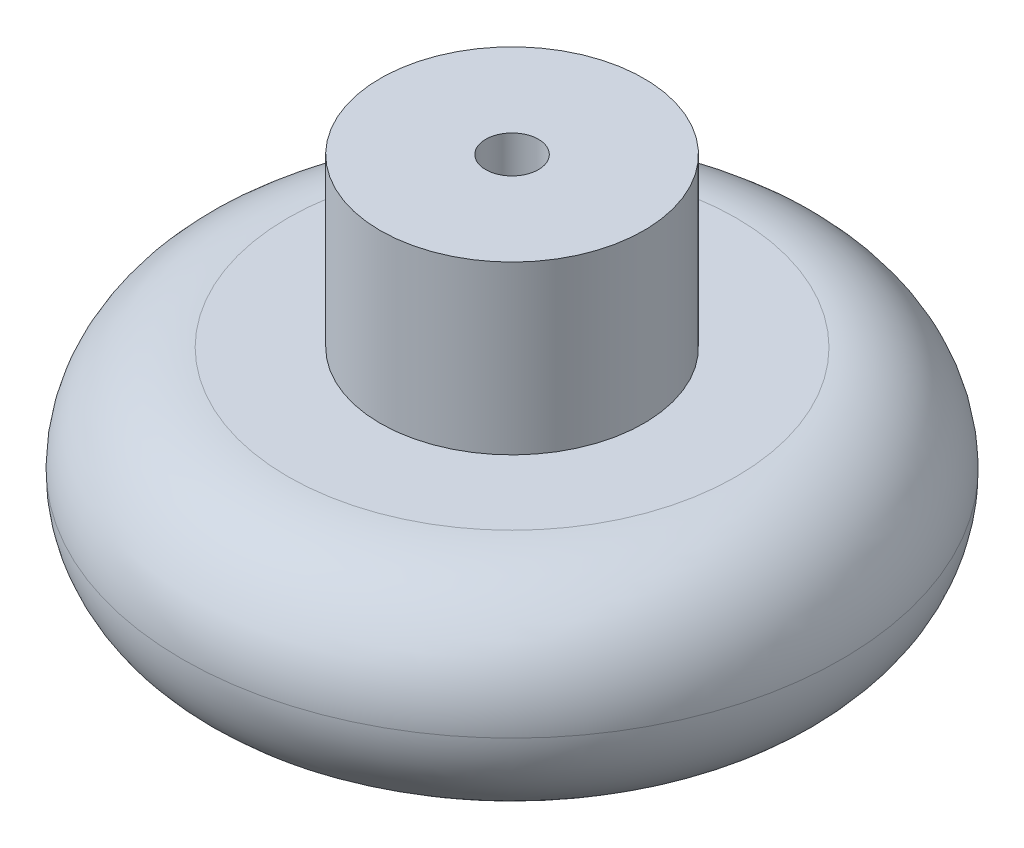
ISO-10303-21;
HEADER;
FILE_DESCRIPTION(('STEP AP214'),'2;1');
FILE_NAME('part.step','',(''),(''),'','','');
FILE_SCHEMA(('AUTOMOTIVE_DESIGN { 1 0 10303 214 1 1 1 1 }'));
ENDSEC;
DATA;
#1=APPLICATION_CONTEXT('core data for automotive mechanical design processes');
#2=APPLICATION_PROTOCOL_DEFINITION('international standard','automotive_design',2000,#1);
#3=PRODUCT_CONTEXT('',#1,'mechanical');
#4=PRODUCT('Part','Part','',(#3));
#5=PRODUCT_RELATED_PRODUCT_CATEGORY('part','',(#4));
#6=PRODUCT_DEFINITION_FORMATION('','',#4);
#7=PRODUCT_DEFINITION_CONTEXT('part definition',#1,'design');
#8=PRODUCT_DEFINITION('design','',#6,#7);
#9=PRODUCT_DEFINITION_SHAPE('','',#8);
#10=(LENGTH_UNIT() NAMED_UNIT(*) SI_UNIT(.MILLI.,.METRE.));
#11=(NAMED_UNIT(*) PLANE_ANGLE_UNIT() SI_UNIT($,.RADIAN.));
#12=(NAMED_UNIT(*) SI_UNIT($,.STERADIAN.) SOLID_ANGLE_UNIT());
#13=UNCERTAINTY_MEASURE_WITH_UNIT(LENGTH_MEASURE(1.E-05),#10,'distance_accuracy_value','');
#14=(GEOMETRIC_REPRESENTATION_CONTEXT(3) GLOBAL_UNCERTAINTY_ASSIGNED_CONTEXT((#13)) GLOBAL_UNIT_ASSIGNED_CONTEXT((#10,
#11,#12)) REPRESENTATION_CONTEXT('',''));
#15=CARTESIAN_POINT('',(0.,0.,0.));
#16=DIRECTION('',(0.,0.,1.));
#17=DIRECTION('',(1.,0.,0.));
#18=AXIS2_PLACEMENT_3D('',#15,#16,#17);
#19=CARTESIAN_POINT('',(0.,24.,0.));
#20=DIRECTION('',(0.,1.,0.));
#21=DIRECTION('',(0.,0.,1.));
#22=AXIS2_PLACEMENT_3D('',#19,#20,#21);
#23=PLANE('',#22);
#24=CARTESIAN_POINT('',(0.,24.,0.));
#25=DIRECTION('',(0.,1.,0.));
#26=DIRECTION('',(0.,0.,1.));
#27=AXIS2_PLACEMENT_3D('',#24,#25,#26);
#28=CIRCLE('',#27,25.5);
#29=CARTESIAN_POINT('',(0.,24.,25.5));
#30=VERTEX_POINT('',#29);
#31=EDGE_CURVE('E46',#30,#30,#28,.T.);
#32=ORIENTED_EDGE('',*,*,#31,.T.);
#33=EDGE_LOOP('',(#32));
#34=FACE_BOUND('',#33,.T.);
#35=CARTESIAN_POINT('',(0.,24.,0.));
#36=DIRECTION('',(0.,1.,0.));
#37=DIRECTION('',(0.,0.,1.));
#38=AXIS2_PLACEMENT_3D('',#35,#36,#37);
#39=CIRCLE('',#38,15.);
#40=CARTESIAN_POINT('',(0.,24.,15.));
#41=VERTEX_POINT('',#40);
#42=EDGE_CURVE('E59',#41,#41,#39,.T.);
#43=ORIENTED_EDGE('',*,*,#42,.F.);
#44=EDGE_LOOP('',(#43));
#45=FACE_BOUND('',#44,.T.);
#46=ADVANCED_FACE('F35',(#34,#45),#23,.T.);
#47=CARTESIAN_POINT('',(0.,0.,0.));
#48=DIRECTION('',(0.,1.,0.));
#49=DIRECTION('',(0.,0.,1.));
#50=AXIS2_PLACEMENT_3D('',#47,#48,#49);
#51=PLANE('',#50);
#52=CARTESIAN_POINT('',(0.,0.,0.));
#53=DIRECTION('',(0.,1.,0.));
#54=DIRECTION('',(0.,0.,1.));
#55=AXIS2_PLACEMENT_3D('',#52,#53,#54);
#56=CIRCLE('',#55,25.5);
#57=CARTESIAN_POINT('',(0.,0.,25.5));
#58=VERTEX_POINT('',#57);
#59=EDGE_CURVE('E71',#58,#58,#56,.F.);
#60=ORIENTED_EDGE('',*,*,#59,.T.);
#61=EDGE_LOOP('',(#60));
#62=FACE_BOUND('',#61,.T.);
#63=ADVANCED_FACE('F100',(#62),#51,.F.);
#64=CARTESIAN_POINT('',(0.,43.,0.));
#65=DIRECTION('',(0.,-1.,0.));
#66=DIRECTION('',(0.,0.,-1.));
#67=AXIS2_PLACEMENT_3D('',#64,#65,#66);
#68=CYLINDRICAL_SURFACE('',#67,15.);
#69=CARTESIAN_POINT('',(-6.9272823588192,32.9898204132693,-13.3046142041471));
#70=CARTESIAN_POINT('',(-6.92727780242257,32.8504446651075,-13.3046183207948));
#71=CARTESIAN_POINT('',(-6.91676671643166,32.7109928071978,-13.31010567698));
#72=CARTESIAN_POINT('',(-6.87496727790503,32.4360018700061,-13.3317424831991));
#73=CARTESIAN_POINT('',(-6.84365976442641,32.3004665195112,-13.3479017658122));
#74=CARTESIAN_POINT('',(-6.76109015046208,32.0373281299277,-13.3899137727955));
#75=CARTESIAN_POINT('',(-6.70984472674675,31.909718564607,-13.4157583953433));
#76=CARTESIAN_POINT('',(-6.58866756767793,31.6658394585515,-13.4756820785763));
#77=CARTESIAN_POINT('',(-6.51873793516153,31.5495686436919,-13.5097602125696));
#78=CARTESIAN_POINT('',(-6.36116067787329,31.3305075635247,-13.5846711696785));
#79=CARTESIAN_POINT('',(-6.27336217770345,31.2278452818831,-13.6255609340721));
#80=CARTESIAN_POINT('',(-6.08254075465278,31.0400271064075,-13.7118065824849));
#81=CARTESIAN_POINT('',(-5.97951693006227,30.9548722501539,-13.7571627309695));
#82=CARTESIAN_POINT('',(-5.76010817704032,30.80400584605,-13.8504666961285));
#83=CARTESIAN_POINT('',(-5.64364715717644,30.7384134055375,-13.8984283681062));
#84=CARTESIAN_POINT('',(-5.40088287131594,30.6292993427387,-13.9945520473443));
#85=CARTESIAN_POINT('',(-5.2745802458889,30.5857762853844,-14.0427140413733));
#86=CARTESIAN_POINT('',(-5.01677816303173,30.5224278782854,-14.1368520282793));
#87=CARTESIAN_POINT('',(-4.88533743550289,30.5023874972646,-14.1828440954133));
#88=CARTESIAN_POINT('',(-4.61988936197311,30.4859046591167,-14.2715169680437));
#89=CARTESIAN_POINT('',(-4.48588219104443,30.489460598022,-14.3141979984093));
#90=CARTESIAN_POINT('',(-4.22052781851019,30.5199017647975,-14.3946582388084));
#91=CARTESIAN_POINT('',(-4.08916741722354,30.5465555766784,-14.4324818123333));
#92=CARTESIAN_POINT('',(-3.83155631870856,30.6220714875158,-14.5030004802094));
#93=CARTESIAN_POINT('',(-3.70530577723147,30.6709342628588,-14.5356954183244));
#94=CARTESIAN_POINT('',(-3.46102259637872,30.7897110535846,-14.5957950709894));
#95=CARTESIAN_POINT('',(-3.34303022811231,30.8597204253517,-14.6231748795355));
#96=CARTESIAN_POINT('',(-3.11934990516638,31.0187332359043,-14.6725183708782));
#97=CARTESIAN_POINT('',(-3.01366294741874,31.1077382119801,-14.6944816150088));
#98=CARTESIAN_POINT('',(-2.81653696715514,31.3034992198886,-14.7335453477559));
#99=CARTESIAN_POINT('',(-2.72528635711333,31.4104575081702,-14.7505836084501));
#100=CARTESIAN_POINT('',(-2.56145212247787,31.6384075034851,-14.779915816086));
#101=CARTESIAN_POINT('',(-2.48886867007452,31.7593993399521,-14.7922097192652));
#102=CARTESIAN_POINT('',(-2.36466896217775,32.0122120551467,-14.8125732135999));
#103=CARTESIAN_POINT('',(-2.31307628245807,32.1440449113614,-14.8206380578099));
#104=CARTESIAN_POINT('',(-2.23275792027019,32.4146694855768,-14.8329517997395));
#105=CARTESIAN_POINT('',(-2.20403022435002,32.5534605897017,-14.8372010334594));
#106=CARTESIAN_POINT('',(-2.17066599096032,32.8322865694314,-14.8421189211581));
#107=CARTESIAN_POINT('',(-2.16574582421522,32.9722867929714,-14.8428297328247));
#108=CARTESIAN_POINT('',(-2.17940233706688,33.2511070849601,-14.8408305453082));
#109=CARTESIAN_POINT('',(-2.19797810910972,33.3899271987832,-14.8381206782522));
#110=CARTESIAN_POINT('',(-2.25777510827337,33.6615481724601,-14.8291384379638));
#111=CARTESIAN_POINT('',(-2.29885234559983,33.7943815531473,-14.8228887082182));
#112=CARTESIAN_POINT('',(-2.40216339111397,34.0512905795487,-14.8064962173186));
#113=CARTESIAN_POINT('',(-2.46439846493326,34.1753657008202,-14.7963532232705));
#114=CARTESIAN_POINT('',(-2.60868149990205,34.4124950076754,-14.7716000327984));
#115=CARTESIAN_POINT('',(-2.69090691097216,34.5254369860253,-14.7569494959644));
#116=CARTESIAN_POINT('',(-2.87229114683576,34.7359339459643,-14.7227185377231));
#117=CARTESIAN_POINT('',(-2.97145116264185,34.833487844379,-14.703137769526));
#118=CARTESIAN_POINT('',(-3.18482055371841,35.011472305998,-14.6584071378269));
#119=CARTESIAN_POINT('',(-3.2991757141507,35.0917142395538,-14.6332014747938));
#120=CARTESIAN_POINT('',(-3.53866048386326,35.2314757402741,-14.5771390938573));
#121=CARTESIAN_POINT('',(-3.66378974446007,35.2909959777431,-14.5462825587974));
#122=CARTESIAN_POINT('',(-3.92049009047511,35.3873309972241,-14.4792010695717));
#123=CARTESIAN_POINT('',(-4.05203042361762,35.4242444890042,-14.4430003231728));
#124=CARTESIAN_POINT('',(-4.31811984807649,35.4746360122331,-14.3656890679258));
#125=CARTESIAN_POINT('',(-4.45266869090293,35.4881159720016,-14.3245789633609));
#126=CARTESIAN_POINT('',(-4.71916345604954,35.4912022955814,-14.2389904540563));
#127=CARTESIAN_POINT('',(-4.85112117133239,35.4810956672103,-14.1945588452304));
#128=CARTESIAN_POINT('',(-5.11036349414499,35.4379164909998,-14.1033001419827));
#129=CARTESIAN_POINT('',(-5.2376481278379,35.4048440717596,-14.0564730609759));
#130=CARTESIAN_POINT('',(-5.4839660244091,35.3167822477256,-13.9622169504601));
#131=CARTESIAN_POINT('',(-5.60300830162987,35.2618172450592,-13.9147886478859));
#132=CARTESIAN_POINT('',(-5.82996234609605,35.1315624770387,-13.8212381435791));
#133=CARTESIAN_POINT('',(-5.93787358537406,35.0562717482068,-13.7751160038757));
#134=CARTESIAN_POINT('',(-6.14110194818678,34.8864853208088,-13.6857352592499));
#135=CARTESIAN_POINT('',(-6.23626060304549,34.791779458518,-13.6425155193918));
#136=CARTESIAN_POINT('',(-6.41023305640028,34.5862921053654,-13.5616422167671));
#137=CARTESIAN_POINT('',(-6.48904302127271,34.4755068543567,-13.5239899601193));
#138=CARTESIAN_POINT('',(-6.62889146567425,34.2400750907796,-13.4559988345835));
#139=CARTESIAN_POINT('',(-6.68980029516544,34.1153360735038,-13.4257135809461));
#140=CARTESIAN_POINT('',(-6.79152387102892,33.8562111774311,-13.3745457212693));
#141=CARTESIAN_POINT('',(-6.83235869165766,33.7218350905919,-13.3536537236512));
#142=CARTESIAN_POINT('',(-6.88410831618734,33.4874166437819,-13.3270256248412));
#143=CARTESIAN_POINT('',(-6.90027627654882,33.3887936053067,-13.3186461880029));
#144=CARTESIAN_POINT('',(-6.92186483722055,33.1900669284323,-13.3074390491218));
#145=CARTESIAN_POINT('',(-6.92728563263689,33.0899633169451,-13.3046112462935));
#146=CARTESIAN_POINT('',(-6.9272823588192,32.9898204132693,-13.3046142041471));
#147=B_SPLINE_CURVE_WITH_KNOTS('',3,(#69,#70,#71,#72,#73,#74,#75,#76,#77,#78,#79,#80,#81,#82,
#83,#84,#85,#86,#87,#88,#89,#90,#91,#92,#93,#94,#95,#96,#97,#98,#99,#100,#101,#102,#103,#104,
#105,#106,#107,#108,#109,#110,#111,#112,#113,#114,#115,#116,#117,#118,#119,#120,#121,#122,#123,
#124,#125,#126,#127,#128,#129,#130,#131,#132,#133,#134,#135,#136,#137,#138,#139,#140,#141,#142,
#143,#144,#145,#146),.UNSPECIFIED.,.T.,.F.,(4,2,2,2,2,2,2,2,2,2,2,2,2,2,2,2,2,2,2,2,2,2,2,2,2,2,
2,2,2,2,2,2,2,2,2,2,2,2,4),(0.,0.417761038927736,0.83590751996297,1.25370499787518,
1.67145547405273,2.09289159155714,2.51435267834446,2.93832980111434,3.36227935111112,
3.78231567472564,4.2023234465269,4.61817121164667,5.03403164249531,5.45179604139423,
5.86959426226762,6.2924612346212,6.71533210746016,7.13867662498601,7.56198385938074,
7.98023542420407,8.39847083413972,8.81406064635488,9.2296753229357,9.64912342762698,
10.0686010443069,10.4924411303538,10.9162675047669,11.3382298441764,11.7601574591235,
12.1769777626591,12.5937957321882,13.0101503983245,13.4265248039233,13.8476699746325,
14.2689137888181,14.6931372761831,15.1169356674445,15.4171067054376,15.7172722940181),.UNSPECIFIED.);
#148=CARTESIAN_POINT('',(-6.9272823588192,32.9898204132693,-13.3046142041471));
#149=VERTEX_POINT('',#148);
#150=EDGE_CURVE('E11',#149,#149,#147,.T.);
#151=ORIENTED_EDGE('',*,*,#150,.T.);
#152=EDGE_LOOP('',(#151));
#153=FACE_BOUND('',#152,.T.);
#154=CARTESIAN_POINT('',(0.,43.,0.));
#155=DIRECTION('',(0.,1.,0.));
#156=DIRECTION('',(0.,0.,1.));
#157=AXIS2_PLACEMENT_3D('',#154,#155,#156);
#158=CIRCLE('',#157,15.);
#159=CARTESIAN_POINT('',(0.,43.,15.));
#160=VERTEX_POINT('',#159);
#161=EDGE_CURVE('E63',#160,#160,#158,.T.);
#162=ORIENTED_EDGE('',*,*,#161,.F.);
#163=EDGE_LOOP('',(#162));
#164=FACE_BOUND('',#163,.T.);
#165=ORIENTED_EDGE('',*,*,#42,.T.);
#166=EDGE_LOOP('',(#165));
#167=FACE_BOUND('',#166,.T.);
#168=ADVANCED_FACE('F106',(#153,#164,#167),#68,.T.);
#169=CARTESIAN_POINT('',(0.,43.,0.));
#170=DIRECTION('',(0.,1.,0.));
#171=DIRECTION('',(0.,0.,1.));
#172=AXIS2_PLACEMENT_3D('',#169,#170,#171);
#173=PLANE('',#172);
#174=CARTESIAN_POINT('',(0.,43.,0.));
#175=DIRECTION('',(0.,1.,0.));
#176=DIRECTION('',(0.,0.,1.));
#177=AXIS2_PLACEMENT_3D('',#174,#175,#176);
#178=CIRCLE('',#177,2.99999999999999);
#179=CARTESIAN_POINT('',(0.,43.,2.99999999999999));
#180=VERTEX_POINT('',#179);
#181=EDGE_CURVE('E60',#180,#180,#178,.T.);
#182=ORIENTED_EDGE('',*,*,#181,.F.);
#183=EDGE_LOOP('',(#182));
#184=FACE_BOUND('',#183,.T.);
#185=ORIENTED_EDGE('',*,*,#161,.T.);
#186=EDGE_LOOP('',(#185));
#187=FACE_BOUND('',#186,.T.);
#188=ADVANCED_FACE('F53',(#184,#187),#173,.T.);
#189=CARTESIAN_POINT('',(0.,28.,0.));
#190=DIRECTION('',(0.,1.,0.));
#191=DIRECTION('',(0.,0.,1.));
#192=AXIS2_PLACEMENT_3D('',#189,#190,#191);
#193=CONICAL_SURFACE('',#192,3.,1.02974425867665);
#194=CARTESIAN_POINT('',(0.,26.1974181429173,0.));
#195=VERTEX_POINT('',#194);
#196=VERTEX_LOOP('',#195);
#197=FACE_BOUND('',#196,.T.);
#198=CARTESIAN_POINT('',(0.,28.,0.));
#199=DIRECTION('',(0.,1.,0.));
#200=DIRECTION('',(0.,0.,1.));
#201=AXIS2_PLACEMENT_3D('',#198,#199,#200);
#202=CIRCLE('',#201,3.);
#203=CARTESIAN_POINT('',(0.,28.,3.));
#204=VERTEX_POINT('',#203);
#205=EDGE_CURVE('E57',#204,#204,#202,.T.);
#206=ORIENTED_EDGE('',*,*,#205,.T.);
#207=EDGE_LOOP('',(#206));
#208=FACE_BOUND('',#207,.T.);
#209=ADVANCED_FACE('F49',(#197,#208),#193,.F.);
#210=CARTESIAN_POINT('',(0.,43.,0.));
#211=DIRECTION('',(0.,1.,0.));
#212=DIRECTION('',(0.,0.,1.));
#213=AXIS2_PLACEMENT_3D('',#210,#211,#212);
#214=CYLINDRICAL_SURFACE('',#213,2.99999999999999);
#215=CARTESIAN_POINT('',(-2.88882716119434,32.9898204132693,-0.809121519146429));
#216=CARTESIAN_POINT('',(-2.88882622678336,33.0781248234548,-0.809138730708966));
#217=CARTESIAN_POINT('',(-2.88653628773825,33.1665801992791,-0.817437723933787));
#218=CARTESIAN_POINT('',(-2.87738476962727,33.340598297172,-0.849059761040668));
#219=CARTESIAN_POINT('',(-2.87050747975259,33.4261500129543,-0.872434427115916));
#220=CARTESIAN_POINT('',(-2.84859481289361,33.6249257239116,-0.941950058076777));
#221=CARTESIAN_POINT('',(-2.83142978295489,33.7360120677567,-0.993404856717218));
#222=CARTESIAN_POINT('',(-2.78787189763919,33.9489982298445,-1.10979476938766));
#223=CARTESIAN_POINT('',(-2.76144912218995,34.0508668979223,-1.17477331093313));
#224=CARTESIAN_POINT('',(-2.70743317316693,34.2188660272814,-1.29337382253563));
#225=CARTESIAN_POINT('',(-2.68218982505392,34.2870820046245,-1.34515857987072));
#226=CARTESIAN_POINT('',(-2.62625101598361,34.4191075136667,-1.45134921557593));
#227=CARTESIAN_POINT('',(-2.59555321045207,34.4829151340069,-1.50575621374629));
#228=CARTESIAN_POINT('',(-2.49485341059255,34.6675771808729,-1.67101059474912));
#229=CARTESIAN_POINT('',(-2.4161555995191,34.7819570456932,-1.78410369451235));
#230=CARTESIAN_POINT('',(-2.25276716950382,34.9684144190579,-1.98445953704825));
#231=CARTESIAN_POINT('',(-2.17288847646248,35.0443186358491,-2.07211295390701));
#232=CARTESIAN_POINT('',(-1.99664033735573,35.1811574706615,-2.24240088914907));
#233=CARTESIAN_POINT('',(-1.90029803729209,35.2421163347799,-2.32504337066355));
#234=CARTESIAN_POINT('',(-1.70962838853483,35.336933278342,-2.46754817326239));
#235=CARTESIAN_POINT('',(-1.61783079668817,35.3736543779249,-2.52887899758975));
#236=CARTESIAN_POINT('',(-1.42454306202922,35.4328008229556,-2.64257740651072));
#237=CARTESIAN_POINT('',(-1.32305854399602,35.4552344071773,-2.69495014394057));
#238=CARTESIAN_POINT('',(-1.11237482345107,35.4844219089146,-2.78854002839115));
#239=CARTESIAN_POINT('',(-1.00314529805749,35.4911102430168,-2.82970988535766));
#240=CARTESIAN_POINT('',(-0.780825617293564,35.4881181681539,-2.89894159412579));
#241=CARTESIAN_POINT('',(-0.667735547502578,35.4784381218076,-2.92700373629299));
#242=CARTESIAN_POINT('',(-0.44911186554329,35.4446061637255,-2.96813902900176));
#243=CARTESIAN_POINT('',(-0.343580585173841,35.4214692954234,-2.98209187662483));
#244=CARTESIAN_POINT('',(-0.135138971310875,35.3628725820368,-2.99877993186454));
#245=CARTESIAN_POINT('',(-0.032229016067824,35.3274109692141,-3.0015135295833));
#246=CARTESIAN_POINT('',(0.177551597235606,35.242229241818,-2.99673251408362));
#247=CARTESIAN_POINT('',(0.284007574369969,35.191548644105,-2.98832089172411));
#248=CARTESIAN_POINT('',(0.489736654911044,35.0794237203322,-2.96157994188846));
#249=CARTESIAN_POINT('',(0.589003188077242,35.0179697198578,-2.94324166920828));
#250=CARTESIAN_POINT('',(0.824605797633319,34.854361088795,-2.88803873372563));
#251=CARTESIAN_POINT('',(0.956120646611652,34.7467491898714,-2.8465109921655));
#252=CARTESIAN_POINT('',(1.13797395690933,34.5725801105462,-2.77655799290615));
#253=CARTESIAN_POINT('',(1.19609161171644,34.5123062449623,-2.75192400031983));
#254=CARTESIAN_POINT('',(1.30685489995918,34.38754862778,-2.70108056306962));
#255=CARTESIAN_POINT('',(1.35950249926578,34.3230664022743,-2.67487168978069));
#256=CARTESIAN_POINT('',(1.48211578747752,34.1587018087951,-2.60962279845942));
#257=CARTESIAN_POINT('',(1.54867898350775,34.0563568138353,-2.57030949376401));
#258=CARTESIAN_POINT('',(1.66643885672131,33.841959241732,-2.49555839108738));
#259=CARTESIAN_POINT('',(1.71767907194711,33.7299353576424,-2.46010979801956));
#260=CARTESIAN_POINT('',(1.7868346489204,33.5339999607573,-2.41006830350319));
#261=CARTESIAN_POINT('',(1.81016832050047,33.4528216629859,-2.39244340024119));
#262=CARTESIAN_POINT('',(1.84583304321866,33.2868592675945,-2.36504059593839));
#263=CARTESIAN_POINT('',(1.8581899649351,33.2020841443743,-2.35524424965009));
#264=CARTESIAN_POINT('',(1.87049195928601,33.0303927066988,-2.34549306878248));
#265=CARTESIAN_POINT('',(1.87034741055632,32.9434653986019,-2.34560929603047));
#266=CARTESIAN_POINT('',(1.85743864645926,32.7711147257557,-2.35583846743471));
#267=CARTESIAN_POINT('',(1.84465695729052,32.6856936101391,-2.36596525352587));
#268=CARTESIAN_POINT('',(1.8034230534005,32.4976359559302,-2.39759820385756));
#269=CARTESIAN_POINT('',(1.77183008480184,32.3960954447646,-2.42133123927012));
#270=CARTESIAN_POINT('',(1.69501328990134,32.2001879668699,-2.47570836729605));
#271=CARTESIAN_POINT('',(1.64974444957199,32.1058459985765,-2.50637519727379));
#272=CARTESIAN_POINT('',(1.55920820718465,31.943825629976,-2.5634157469138));
#273=CARTESIAN_POINT('',(1.516031862643,31.8747746735216,-2.58929545267763));
#274=CARTESIAN_POINT('',(1.42371053524336,31.7407919160617,-2.64118393686499));
#275=CARTESIAN_POINT('',(1.3745624726559,31.6758622669957,-2.66719277519643));
#276=CARTESIAN_POINT('',(1.27079882806355,31.5499865074427,-2.71816362801294));
#277=CARTESIAN_POINT('',(1.2161787886421,31.4890437125054,-2.74312476517856));
#278=CARTESIAN_POINT('',(1.10187518329467,31.3712354641687,-2.79100803055107));
#279=CARTESIAN_POINT('',(1.04218899476953,31.314372151051,-2.81392908993599));
#280=CARTESIAN_POINT('',(0.852738315098276,31.1473655780863,-2.87939480618132));
#281=CARTESIAN_POINT('',(0.715122697899361,31.0438828745499,-2.91731141214506));
#282=CARTESIAN_POINT('',(0.495991695525114,30.9050997802087,-2.95965247172149));
#283=CARTESIAN_POINT('',(0.42090154784728,30.8616098837553,-2.97133994860952));
#284=CARTESIAN_POINT('',(0.266898527857145,30.7807036722356,-2.98910727177619));
#285=CARTESIAN_POINT('',(0.187987954485827,30.743283762116,-2.99519044736318));
#286=CARTESIAN_POINT('',(5.14356480265271E-05,30.6639030636257,-3.0019219008008));
#287=CARTESIAN_POINT('',(-0.110226171455817,30.6246035892029,-3.00007465915701));
#288=CARTESIAN_POINT('',(-0.333890073934335,30.5601841650188,-2.98346616451629));
#289=CARTESIAN_POINT('',(-0.447273877135507,30.5350531778308,-2.96871498676803));
#290=CARTESIAN_POINT('',(-0.674460357963848,30.5004432614242,-2.92549509247528));
#291=CARTESIAN_POINT('',(-0.788262448220722,30.4910396981857,-2.89696116454425));
#292=CARTESIAN_POINT('',(-1.01186330604178,30.488824781741,-2.82663449462441));
#293=CARTESIAN_POINT('',(-1.12166236538016,30.4960122167787,-2.78484272114045));
#294=CARTESIAN_POINT('',(-1.32598359219312,30.5253154602884,-2.6932132418857));
#295=CARTESIAN_POINT('',(-1.42103600257382,30.546306450028,-2.64418271741249));
#296=CARTESIAN_POINT('',(-1.60268551091836,30.6008642655331,-2.53820169639244));
#297=CARTESIAN_POINT('',(-1.68928128397037,30.6344330579064,-2.48124996219745));
#298=CARTESIAN_POINT('',(-1.8588427758975,30.7154375685513,-2.35722810057908));
#299=CARTESIAN_POINT('',(-1.94109016050273,30.763702185374,-2.28972374377303));
#300=CARTESIAN_POINT('',(-2.09421068177954,30.8710253461528,-2.15058561053072));
#301=CARTESIAN_POINT('',(-2.16507496910758,30.9300922123422,-2.07894867962261));
#302=CARTESIAN_POINT('',(-2.32682291321104,31.087864160895,-1.8991140122329));
#303=CARTESIAN_POINT('',(-2.41115927563684,31.1920467700181,-1.78975812802847));
#304=CARTESIAN_POINT('',(-2.5208349163258,31.3609741425455,-1.62778514713446));
#305=CARTESIAN_POINT('',(-2.55462749866447,31.4194917137674,-1.57405679396157));
#306=CARTESIAN_POINT('',(-2.61689282213003,31.5406618829952,-1.46820841103807));
#307=CARTESIAN_POINT('',(-2.64536720165583,31.6033131994266,-1.41608789010115));
#308=CARTESIAN_POINT('',(-2.71194538801575,31.7693121017818,-1.28580388096511));
#309=CARTESIAN_POINT('',(-2.74640724150037,31.8756627616155,-1.20955386632849));
#310=CARTESIAN_POINT('',(-2.80388960298974,32.0990760979798,-1.06952602342737));
#311=CARTESIAN_POINT('',(-2.82694134182685,32.2161084843252,-1.00571444356576));
#312=CARTESIAN_POINT('',(-2.85631764235449,32.4196946497319,-0.918057071015229));
#313=CARTESIAN_POINT('',(-2.86566440477698,32.5030942054709,-0.8879986957831));
#314=CARTESIAN_POINT('',(-2.8797268476295,32.6738482820952,-0.841301506420494));
#315=CARTESIAN_POINT('',(-2.88446034800703,32.7611862102019,-0.824611099873475));
#316=CARTESIAN_POINT('',(-2.88753789094163,32.8726117380827,-0.81371163913869));
#317=CARTESIAN_POINT('',(-2.88802109119419,32.8960132381448,-0.811995144020688));
#318=CARTESIAN_POINT('',(-2.88866588053993,32.9428797326615,-0.809697690213122));
#319=CARTESIAN_POINT('',(-2.88882740960694,32.9663447381486,-0.809116943462728));
#320=CARTESIAN_POINT('',(-2.88882716119434,32.9898204132693,-0.809121519146429));
#321=B_SPLINE_CURVE_WITH_KNOTS('',3,(#215,#216,#217,#218,#219,#220,#221,#222,#223,#224,#225,
#226,#227,#228,#229,#230,#231,#232,#233,#234,#235,#236,#237,#238,#239,#240,#241,#242,#243,#244,
#245,#246,#247,#248,#249,#250,#251,#252,#253,#254,#255,#256,#257,#258,#259,#260,#261,#262,#263,
#264,#265,#266,#267,#268,#269,#270,#271,#272,#273,#274,#275,#276,#277,#278,#279,#280,#281,#282,
#283,#284,#285,#286,#287,#288,#289,#290,#291,#292,#293,#294,#295,#296,#297,#298,#299,#300,#301,
#302,#303,#304,#305,#306,#307,#308,#309,#310,#311,#312,#313,#314,#315,#316,#317,#318,#319,#320),
.UNSPECIFIED.,.T.,.F.,(4,2,2,2,2,2,2,2,2,2,2,2,2,2,2,2,2,2,2,2,2,2,2,2,2,2,2,2,2,2,2,2,2,2,2,2,
2,2,2,2,2,2,2,2,2,2,2,2,2,2,2,2,4),(0.,0.264807486843965,0.530526577859137,0.899311711113922,
1.26929988428697,1.53684271887074,1.80450083499513,2.33872733232381,2.75963734355716,
3.17985991852652,3.52745225260398,3.87484396861112,4.22368012855134,4.57250856061372,
4.89792180788525,5.22338174845519,5.57669292749802,5.93032301720746,6.4521264616981,
6.71375344417631,6.97528607349788,7.35902155845292,7.74165612186453,7.99961659145727,
8.25696746076714,8.51616339578936,8.77571823174387,9.10077852677664,9.42692063321696,
9.68296205217754,9.93913608157874,10.1955205112227,10.4520384827406,10.9775613091594,
11.2398627749286,11.5020083164189,11.8517559716832,12.201230791394,12.5523755496756,
12.9034946622279,13.229053602583,13.5546634671052,13.903879771412,14.25336625993,
14.7693582552691,15.0281495003972,15.2868608867406,15.6916620845259,16.0953490806583,
16.3618811606764,16.6273795605044,16.6977653407009,16.7681642541595),.UNSPECIFIED.);
#322=CARTESIAN_POINT('',(-2.88882716119434,32.9898204132693,-0.809121519146429));
#323=VERTEX_POINT('',#322);
#324=EDGE_CURVE('E77',#323,#323,#321,.T.);
#325=ORIENTED_EDGE('',*,*,#324,.T.);
#326=EDGE_LOOP('',(#325));
#327=FACE_BOUND('',#326,.T.);
#328=ORIENTED_EDGE('',*,*,#205,.F.);
#329=EDGE_LOOP('',(#328));
#330=FACE_BOUND('',#329,.T.);
#331=ORIENTED_EDGE('',*,*,#181,.T.);
#332=EDGE_LOOP('',(#331));
#333=FACE_BOUND('',#332,.T.);
#334=ADVANCED_FACE('F52',(#327,#330,#333),#214,.F.);
#335=CARTESIAN_POINT('',(0.,12.,0.));
#336=DIRECTION('',(0.,1.,0.));
#337=DIRECTION('',(0.,0.,1.));
#338=AXIS2_PLACEMENT_3D('',#335,#336,#337);
#339=TOROIDAL_SURFACE('',#338,25.5,12.);
#340=ORIENTED_EDGE('',*,*,#31,.F.);
#341=EDGE_LOOP('',(#340));
#342=FACE_BOUND('',#341,.T.);
#343=CARTESIAN_POINT('',(0.,12.,0.));
#344=DIRECTION('',(0.,1.,0.));
#345=DIRECTION('',(0.,0.,1.));
#346=AXIS2_PLACEMENT_3D('',#343,#344,#345);
#347=CIRCLE('',#346,37.5);
#348=CARTESIAN_POINT('',(0.,12.,37.5));
#349=VERTEX_POINT('',#348);
#350=EDGE_CURVE('E66',#349,#349,#347,.F.);
#351=ORIENTED_EDGE('',*,*,#350,.F.);
#352=EDGE_LOOP('',(#351));
#353=FACE_BOUND('',#352,.T.);
#354=ADVANCED_FACE('F37',(#342,#353),#339,.T.);
#355=CARTESIAN_POINT('',(0.,12.,0.));
#356=DIRECTION('',(0.,1.,0.));
#357=DIRECTION('',(0.,0.,1.));
#358=AXIS2_PLACEMENT_3D('',#355,#356,#357);
#359=TOROIDAL_SURFACE('',#358,25.5,12.);
#360=ORIENTED_EDGE('',*,*,#59,.F.);
#361=EDGE_LOOP('',(#360));
#362=FACE_BOUND('',#361,.T.);
#363=ORIENTED_EDGE('',*,*,#350,.T.);
#364=EDGE_LOOP('',(#363));
#365=FACE_BOUND('',#364,.T.);
#366=ADVANCED_FACE('F90',(#362,#365),#359,.T.);
#367=CARTESIAN_POINT('',(-4.61295681844765,32.9898204132693,-14.2730735789856));
#368=DIRECTION('',(-0.307530454563177,0.,-0.951538238599041));
#369=DIRECTION('',(-0.951538238599041,0.,0.307530454563177));
#370=AXIS2_PLACEMENT_3D('',#367,#368,#369);
#371=CYLINDRICAL_SURFACE('',#370,2.49999999999999);
#372=ORIENTED_EDGE('',*,*,#150,.F.);
#373=EDGE_LOOP('',(#372));
#374=FACE_BOUND('',#373,.T.);
#375=ORIENTED_EDGE('',*,*,#324,.F.);
#376=EDGE_LOOP('',(#375));
#377=FACE_BOUND('',#376,.T.);
#378=ADVANCED_FACE('F87',(#374,#377),#371,.F.);
#379=CLOSED_SHELL('',(#46,#63,#168,#188,#209,#334,#354,#366,#378));
#380=MANIFOLD_SOLID_BREP('B2',#379);
#381=ADVANCED_BREP_SHAPE_REPRESENTATION('',(#18,#380),#14);
#382=SHAPE_DEFINITION_REPRESENTATION(#9,#381);
ENDSEC;
END-ISO-10303-21;
